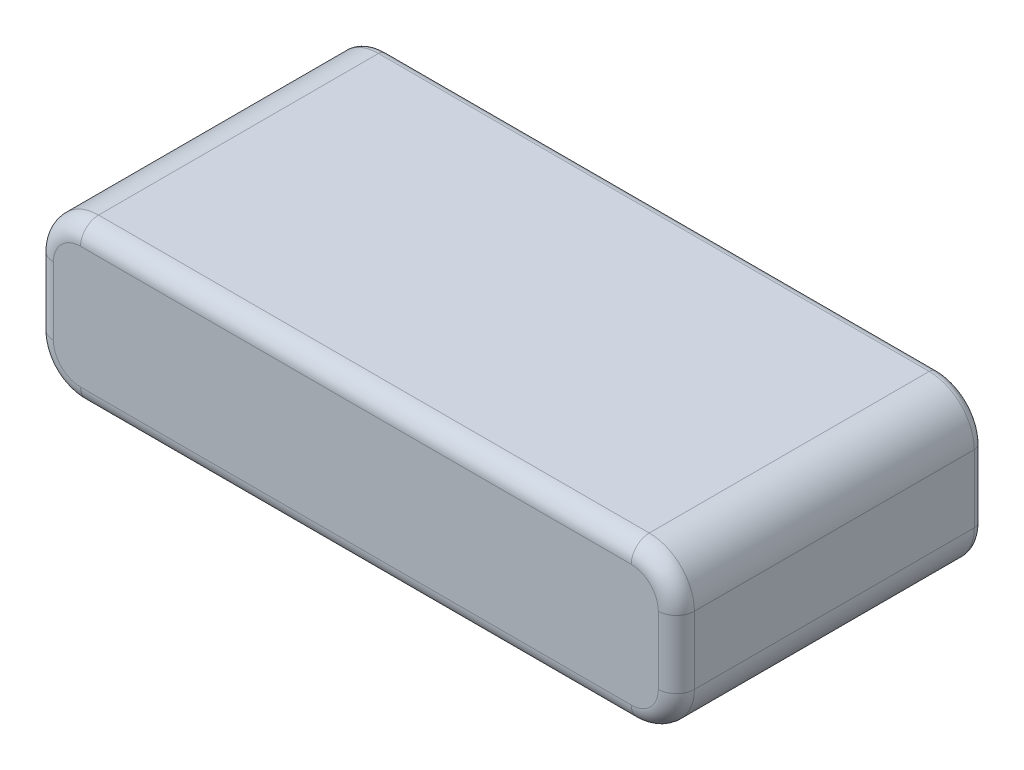
ISO-10303-21;
HEADER;
FILE_DESCRIPTION(('STEP AP214'),'2;1');
FILE_NAME('part.step','',(''),(''),'','','');
FILE_SCHEMA(('AUTOMOTIVE_DESIGN { 1 0 10303 214 1 1 1 1 }'));
ENDSEC;
DATA;
#1=APPLICATION_CONTEXT('core data for automotive mechanical design processes');
#2=APPLICATION_PROTOCOL_DEFINITION('international standard','automotive_design',2000,#1);
#3=PRODUCT_CONTEXT('',#1,'mechanical');
#4=PRODUCT('Part','Part','',(#3));
#5=PRODUCT_RELATED_PRODUCT_CATEGORY('part','',(#4));
#6=PRODUCT_DEFINITION_FORMATION('','',#4);
#7=PRODUCT_DEFINITION_CONTEXT('part definition',#1,'design');
#8=PRODUCT_DEFINITION('design','',#6,#7);
#9=PRODUCT_DEFINITION_SHAPE('','',#8);
#10=(LENGTH_UNIT() NAMED_UNIT(*) SI_UNIT(.MILLI.,.METRE.));
#11=(NAMED_UNIT(*) PLANE_ANGLE_UNIT() SI_UNIT($,.RADIAN.));
#12=(NAMED_UNIT(*) SI_UNIT($,.STERADIAN.) SOLID_ANGLE_UNIT());
#13=UNCERTAINTY_MEASURE_WITH_UNIT(LENGTH_MEASURE(1.E-05),#10,'distance_accuracy_value','');
#14=(GEOMETRIC_REPRESENTATION_CONTEXT(3) GLOBAL_UNCERTAINTY_ASSIGNED_CONTEXT((#13)) GLOBAL_UNIT_ASSIGNED_CONTEXT((#10,
#11,#12)) REPRESENTATION_CONTEXT('',''));
#15=CARTESIAN_POINT('',(0.,0.,0.));
#16=DIRECTION('',(0.,0.,1.));
#17=DIRECTION('',(1.,0.,0.));
#18=AXIS2_PLACEMENT_3D('',#15,#16,#17);
#19=CARTESIAN_POINT('',(-35.5,17.5,17.));
#20=DIRECTION('',(1.,0.,0.));
#21=DIRECTION('',(0.,0.,-1.));
#22=AXIS2_PLACEMENT_3D('',#19,#20,#21);
#23=PLANE('',#22);
#24=DIRECTION('',(0.,0.,1.));
#25=VECTOR('',#24,1.);
#26=CARTESIAN_POINT('',(-35.5,12.5,-17.));
#27=LINE('',#26,#25);
#28=CARTESIAN_POINT('',(-35.5,12.5,15.));
#29=VERTEX_POINT('',#28);
#30=CARTESIAN_POINT('',(-35.5,12.5,-16.));
#31=VERTEX_POINT('',#30);
#32=EDGE_CURVE('E244',#29,#31,#27,.F.);
#33=ORIENTED_EDGE('',*,*,#32,.T.);
#34=DIRECTION('',(0.,-1.,0.));
#35=VECTOR('',#34,1.);
#36=CARTESIAN_POINT('',(-35.5,17.5,-16.));
#37=LINE('',#36,#35);
#38=CARTESIAN_POINT('',(-35.5,5.,-16.));
#39=VERTEX_POINT('',#38);
#40=EDGE_CURVE('E66',#31,#39,#37,.T.);
#41=ORIENTED_EDGE('',*,*,#40,.T.);
#42=DIRECTION('',(0.,0.,1.));
#43=VECTOR('',#42,1.);
#44=CARTESIAN_POINT('',(-35.5,5.,17.));
#45=LINE('',#44,#43);
#46=CARTESIAN_POINT('',(-35.5,5.,15.));
#47=VERTEX_POINT('',#46);
#48=EDGE_CURVE('E333',#39,#47,#45,.T.);
#49=ORIENTED_EDGE('',*,*,#48,.T.);
#50=DIRECTION('',(0.,-1.,0.));
#51=VECTOR('',#50,1.);
#52=CARTESIAN_POINT('',(-35.5,17.5,15.));
#53=LINE('',#52,#51);
#54=EDGE_CURVE('E216',#47,#29,#53,.F.);
#55=ORIENTED_EDGE('',*,*,#54,.T.);
#56=EDGE_LOOP('',(#33,#41,#49,#55));
#57=FACE_BOUND('',#56,.T.);
#58=ADVANCED_FACE('F41',(#57),#23,.F.);
#59=CARTESIAN_POINT('',(35.5,17.5,17.));
#60=DIRECTION('',(0.,0.,-1.));
#61=DIRECTION('',(-1.,0.,0.));
#62=AXIS2_PLACEMENT_3D('',#59,#60,#61);
#63=PLANE('',#62);
#64=DIRECTION('',(1.,0.,0.));
#65=VECTOR('',#64,1.);
#66=CARTESIAN_POINT('',(-30.5,15.5,17.));
#67=LINE('',#66,#65);
#68=CARTESIAN_POINT('',(30.5,15.5,17.));
#69=VERTEX_POINT('',#68);
#70=CARTESIAN_POINT('',(-30.5,15.5,17.));
#71=VERTEX_POINT('',#70);
#72=EDGE_CURVE('E184',#69,#71,#67,.F.);
#73=ORIENTED_EDGE('',*,*,#72,.T.);
#74=CARTESIAN_POINT('',(-30.5,12.5,17.));
#75=DIRECTION('',(0.,0.,-1.));
#76=DIRECTION('',(-1.,0.,0.));
#77=AXIS2_PLACEMENT_3D('',#74,#75,#76);
#78=CIRCLE('',#77,3.);
#79=CARTESIAN_POINT('',(-33.5,12.5,17.));
#80=VERTEX_POINT('',#79);
#81=EDGE_CURVE('E163',#71,#80,#78,.F.);
#82=ORIENTED_EDGE('',*,*,#81,.T.);
#83=DIRECTION('',(0.,-1.,0.));
#84=VECTOR('',#83,1.);
#85=CARTESIAN_POINT('',(-33.5,17.5,17.));
#86=LINE('',#85,#84);
#87=CARTESIAN_POINT('',(-33.5,5.,17.));
#88=VERTEX_POINT('',#87);
#89=EDGE_CURVE('E172',#80,#88,#86,.T.);
#90=ORIENTED_EDGE('',*,*,#89,.T.);
#91=CARTESIAN_POINT('',(-30.5,5.,17.));
#92=DIRECTION('',(0.,0.,-1.));
#93=DIRECTION('',(-1.,0.,0.));
#94=AXIS2_PLACEMENT_3D('',#91,#92,#93);
#95=CIRCLE('',#94,3.);
#96=CARTESIAN_POINT('',(-30.5,2.,17.));
#97=VERTEX_POINT('',#96);
#98=EDGE_CURVE('E179',#88,#97,#95,.F.);
#99=ORIENTED_EDGE('',*,*,#98,.T.);
#100=DIRECTION('',(1.,0.,0.));
#101=VECTOR('',#100,1.);
#102=CARTESIAN_POINT('',(35.5,2.,17.));
#103=LINE('',#102,#101);
#104=CARTESIAN_POINT('',(30.5,2.,17.));
#105=VERTEX_POINT('',#104);
#106=EDGE_CURVE('E358',#97,#105,#103,.T.);
#107=ORIENTED_EDGE('',*,*,#106,.T.);
#108=CARTESIAN_POINT('',(30.5,5.,17.));
#109=DIRECTION('',(0.,0.,-1.));
#110=DIRECTION('',(-1.,0.,0.));
#111=AXIS2_PLACEMENT_3D('',#108,#109,#110);
#112=CIRCLE('',#111,3.);
#113=CARTESIAN_POINT('',(33.5,5.,17.));
#114=VERTEX_POINT('',#113);
#115=EDGE_CURVE('E361',#105,#114,#112,.F.);
#116=ORIENTED_EDGE('',*,*,#115,.T.);
#117=DIRECTION('',(0.,-1.,0.));
#118=VECTOR('',#117,1.);
#119=CARTESIAN_POINT('',(33.5,17.5,17.));
#120=LINE('',#119,#118);
#121=CARTESIAN_POINT('',(33.5,12.5,17.));
#122=VERTEX_POINT('',#121);
#123=EDGE_CURVE('E364',#114,#122,#120,.F.);
#124=ORIENTED_EDGE('',*,*,#123,.T.);
#125=CARTESIAN_POINT('',(30.5,12.5,17.));
#126=DIRECTION('',(0.,0.,-1.));
#127=DIRECTION('',(-1.,0.,0.));
#128=AXIS2_PLACEMENT_3D('',#125,#126,#127);
#129=CIRCLE('',#128,3.);
#130=EDGE_CURVE('E192',#122,#69,#129,.F.);
#131=ORIENTED_EDGE('',*,*,#130,.T.);
#132=EDGE_LOOP('',(#73,#82,#90,#99,#107,#116,#124,#131));
#133=FACE_BOUND('',#132,.T.);
#134=ADVANCED_FACE('F182',(#133),#63,.F.);
#135=CARTESIAN_POINT('',(35.5,17.5,17.));
#136=DIRECTION('',(-1.,0.,0.));
#137=DIRECTION('',(0.,0.,1.));
#138=AXIS2_PLACEMENT_3D('',#135,#136,#137);
#139=PLANE('',#138);
#140=DIRECTION('',(0.,0.,-1.));
#141=VECTOR('',#140,1.);
#142=CARTESIAN_POINT('',(35.5,5.,17.));
#143=LINE('',#142,#141);
#144=CARTESIAN_POINT('',(35.5,5.,15.));
#145=VERTEX_POINT('',#144);
#146=CARTESIAN_POINT('',(35.5,5.,-16.));
#147=VERTEX_POINT('',#146);
#148=EDGE_CURVE('E347',#145,#147,#143,.T.);
#149=ORIENTED_EDGE('',*,*,#148,.T.);
#150=DIRECTION('',(0.,-1.,0.));
#151=VECTOR('',#150,1.);
#152=CARTESIAN_POINT('',(35.5,17.5,-16.));
#153=LINE('',#152,#151);
#154=CARTESIAN_POINT('',(35.5,12.5,-16.));
#155=VERTEX_POINT('',#154);
#156=EDGE_CURVE('E273',#147,#155,#153,.F.);
#157=ORIENTED_EDGE('',*,*,#156,.T.);
#158=DIRECTION('',(0.,0.,-1.));
#159=VECTOR('',#158,1.);
#160=CARTESIAN_POINT('',(35.5,12.5,17.));
#161=LINE('',#160,#159);
#162=CARTESIAN_POINT('',(35.5,12.5,15.));
#163=VERTEX_POINT('',#162);
#164=EDGE_CURVE('E344',#155,#163,#161,.F.);
#165=ORIENTED_EDGE('',*,*,#164,.T.);
#166=DIRECTION('',(0.,-1.,0.));
#167=VECTOR('',#166,1.);
#168=CARTESIAN_POINT('',(35.5,17.5,15.));
#169=LINE('',#168,#167);
#170=EDGE_CURVE('E202',#163,#145,#169,.T.);
#171=ORIENTED_EDGE('',*,*,#170,.T.);
#172=EDGE_LOOP('',(#149,#157,#165,#171));
#173=FACE_BOUND('',#172,.T.);
#174=ADVANCED_FACE('F431',(#173),#139,.F.);
#175=CARTESIAN_POINT('',(35.5,17.5,-17.));
#176=DIRECTION('',(0.,0.,1.));
#177=DIRECTION('',(1.,0.,0.));
#178=AXIS2_PLACEMENT_3D('',#175,#176,#177);
#179=PLANE('',#178);
#180=DIRECTION('',(0.,-1.,0.));
#181=VECTOR('',#180,1.);
#182=CARTESIAN_POINT('',(34.5,17.5,-17.));
#183=LINE('',#182,#181);
#184=CARTESIAN_POINT('',(34.5,12.5,-17.));
#185=VERTEX_POINT('',#184);
#186=CARTESIAN_POINT('',(34.5,5.,-17.));
#187=VERTEX_POINT('',#186);
#188=EDGE_CURVE('E262',#185,#187,#183,.T.);
#189=ORIENTED_EDGE('',*,*,#188,.T.);
#190=CARTESIAN_POINT('',(30.5,5.,-17.));
#191=DIRECTION('',(0.,0.,1.));
#192=DIRECTION('',(1.,0.,0.));
#193=AXIS2_PLACEMENT_3D('',#190,#191,#192);
#194=CIRCLE('',#193,4.);
#195=CARTESIAN_POINT('',(30.5,1.,-17.));
#196=VERTEX_POINT('',#195);
#197=EDGE_CURVE('E265',#187,#196,#194,.F.);
#198=ORIENTED_EDGE('',*,*,#197,.T.);
#199=DIRECTION('',(-1.,0.,0.));
#200=VECTOR('',#199,1.);
#201=CARTESIAN_POINT('',(35.5,1.,-17.));
#202=LINE('',#201,#200);
#203=CARTESIAN_POINT('',(-30.5,1.,-17.));
#204=VERTEX_POINT('',#203);
#205=EDGE_CURVE('E218',#196,#204,#202,.T.);
#206=ORIENTED_EDGE('',*,*,#205,.T.);
#207=CARTESIAN_POINT('',(-30.5,5.,-17.));
#208=DIRECTION('',(0.,0.,1.));
#209=DIRECTION('',(1.,0.,0.));
#210=AXIS2_PLACEMENT_3D('',#207,#208,#209);
#211=CIRCLE('',#210,4.);
#212=CARTESIAN_POINT('',(-34.5,5.,-17.));
#213=VERTEX_POINT('',#212);
#214=EDGE_CURVE('E247',#204,#213,#211,.F.);
#215=ORIENTED_EDGE('',*,*,#214,.T.);
#216=DIRECTION('',(0.,-1.,0.));
#217=VECTOR('',#216,1.);
#218=CARTESIAN_POINT('',(-34.5,17.5,-17.));
#219=LINE('',#218,#217);
#220=CARTESIAN_POINT('',(-34.5,12.5,-17.));
#221=VERTEX_POINT('',#220);
#222=EDGE_CURVE('E250',#213,#221,#219,.F.);
#223=ORIENTED_EDGE('',*,*,#222,.T.);
#224=CARTESIAN_POINT('',(-30.5,12.5,-17.));
#225=DIRECTION('',(0.,0.,1.));
#226=DIRECTION('',(1.,0.,0.));
#227=AXIS2_PLACEMENT_3D('',#224,#225,#226);
#228=CIRCLE('',#227,4.);
#229=CARTESIAN_POINT('',(-30.5,16.5,-17.));
#230=VERTEX_POINT('',#229);
#231=EDGE_CURVE('E253',#221,#230,#228,.F.);
#232=ORIENTED_EDGE('',*,*,#231,.T.);
#233=DIRECTION('',(-1.,0.,0.));
#234=VECTOR('',#233,1.);
#235=CARTESIAN_POINT('',(30.5,16.5,-17.));
#236=LINE('',#235,#234);
#237=CARTESIAN_POINT('',(30.5,16.5,-17.));
#238=VERTEX_POINT('',#237);
#239=EDGE_CURVE('E256',#230,#238,#236,.F.);
#240=ORIENTED_EDGE('',*,*,#239,.T.);
#241=CARTESIAN_POINT('',(30.5,12.5,-17.));
#242=DIRECTION('',(0.,0.,1.));
#243=DIRECTION('',(1.,0.,0.));
#244=AXIS2_PLACEMENT_3D('',#241,#242,#243);
#245=CIRCLE('',#244,4.);
#246=EDGE_CURVE('E259',#238,#185,#245,.F.);
#247=ORIENTED_EDGE('',*,*,#246,.T.);
#248=EDGE_LOOP('',(#189,#198,#206,#215,#223,#232,#240,#247));
#249=FACE_BOUND('',#248,.T.);
#250=ADVANCED_FACE('F396',(#249),#179,.F.);
#251=CARTESIAN_POINT('',(0.,17.5,0.));
#252=DIRECTION('',(0.,1.,0.));
#253=DIRECTION('',(0.,0.,1.));
#254=AXIS2_PLACEMENT_3D('',#251,#252,#253);
#255=PLANE('',#254);
#256=DIRECTION('',(0.,0.,-1.));
#257=VECTOR('',#256,1.);
#258=CARTESIAN_POINT('',(30.5,17.5,-17.));
#259=LINE('',#258,#257);
#260=CARTESIAN_POINT('',(30.5,17.5,15.));
#261=VERTEX_POINT('',#260);
#262=CARTESIAN_POINT('',(30.5,17.5,-16.));
#263=VERTEX_POINT('',#262);
#264=EDGE_CURVE('E180',#261,#263,#259,.T.);
#265=ORIENTED_EDGE('',*,*,#264,.T.);
#266=DIRECTION('',(-1.,0.,0.));
#267=VECTOR('',#266,1.);
#268=CARTESIAN_POINT('',(-30.5,17.5,-16.));
#269=LINE('',#268,#267);
#270=CARTESIAN_POINT('',(-30.5,17.5,-16.));
#271=VERTEX_POINT('',#270);
#272=EDGE_CURVE('E279',#263,#271,#269,.T.);
#273=ORIENTED_EDGE('',*,*,#272,.T.);
#274=DIRECTION('',(0.,0.,1.));
#275=VECTOR('',#274,1.);
#276=CARTESIAN_POINT('',(-30.5,17.5,17.));
#277=LINE('',#276,#275);
#278=CARTESIAN_POINT('',(-30.5,17.5,15.));
#279=VERTEX_POINT('',#278);
#280=EDGE_CURVE('E331',#271,#279,#277,.T.);
#281=ORIENTED_EDGE('',*,*,#280,.T.);
#282=DIRECTION('',(1.,0.,0.));
#283=VECTOR('',#282,1.);
#284=CARTESIAN_POINT('',(30.5,17.5,15.));
#285=LINE('',#284,#283);
#286=EDGE_CURVE('E190',#279,#261,#285,.T.);
#287=ORIENTED_EDGE('',*,*,#286,.T.);
#288=EDGE_LOOP('',(#265,#273,#281,#287));
#289=FACE_BOUND('',#288,.T.);
#290=ADVANCED_FACE('F379',(#289),#255,.T.);
#291=CARTESIAN_POINT('',(0.,0.,0.));
#292=DIRECTION('',(0.,1.,0.));
#293=DIRECTION('',(0.,0.,1.));
#294=AXIS2_PLACEMENT_3D('',#291,#292,#293);
#295=PLANE('',#294);
#296=DIRECTION('',(0.,0.,1.));
#297=VECTOR('',#296,1.);
#298=CARTESIAN_POINT('',(-30.5,0.,0.));
#299=LINE('',#298,#297);
#300=CARTESIAN_POINT('',(-30.5,0.,15.));
#301=VERTEX_POINT('',#300);
#302=CARTESIAN_POINT('',(-30.5,0.,-16.));
#303=VERTEX_POINT('',#302);
#304=EDGE_CURVE('E341',#301,#303,#299,.F.);
#305=ORIENTED_EDGE('',*,*,#304,.T.);
#306=DIRECTION('',(-1.,0.,0.));
#307=VECTOR('',#306,1.);
#308=CARTESIAN_POINT('',(0.,0.,-16.));
#309=LINE('',#308,#307);
#310=CARTESIAN_POINT('',(30.5,0.,-16.));
#311=VERTEX_POINT('',#310);
#312=EDGE_CURVE('E11',#303,#311,#309,.F.);
#313=ORIENTED_EDGE('',*,*,#312,.T.);
#314=DIRECTION('',(0.,0.,-1.));
#315=VECTOR('',#314,1.);
#316=CARTESIAN_POINT('',(30.5,0.,0.));
#317=LINE('',#316,#315);
#318=CARTESIAN_POINT('',(30.5,0.,15.));
#319=VERTEX_POINT('',#318);
#320=EDGE_CURVE('E336',#311,#319,#317,.F.);
#321=ORIENTED_EDGE('',*,*,#320,.T.);
#322=DIRECTION('',(1.,0.,0.));
#323=VECTOR('',#322,1.);
#324=CARTESIAN_POINT('',(0.,0.,15.));
#325=LINE('',#324,#323);
#326=EDGE_CURVE('E209',#319,#301,#325,.F.);
#327=ORIENTED_EDGE('',*,*,#326,.T.);
#328=EDGE_LOOP('',(#305,#313,#321,#327));
#329=FACE_BOUND('',#328,.T.);
#330=ADVANCED_FACE('F410',(#329),#295,.F.);
#331=CARTESIAN_POINT('',(-30.5,5.,17.));
#332=DIRECTION('',(0.,0.,1.));
#333=DIRECTION('',(1.,0.,0.));
#334=AXIS2_PLACEMENT_3D('',#331,#332,#333);
#335=CYLINDRICAL_SURFACE('',#334,5.);
#336=ORIENTED_EDGE('',*,*,#48,.F.);
#337=CARTESIAN_POINT('',(-30.5,5.,-16.));
#338=DIRECTION('',(0.,0.,1.));
#339=DIRECTION('',(1.,0.,0.));
#340=AXIS2_PLACEMENT_3D('',#337,#338,#339);
#341=CIRCLE('',#340,5.);
#342=EDGE_CURVE('E51',#39,#303,#341,.T.);
#343=ORIENTED_EDGE('',*,*,#342,.T.);
#344=ORIENTED_EDGE('',*,*,#304,.F.);
#345=CARTESIAN_POINT('',(-30.5,5.,15.));
#346=DIRECTION('',(0.,0.,-1.));
#347=DIRECTION('',(-1.,0.,0.));
#348=AXIS2_PLACEMENT_3D('',#345,#346,#347);
#349=CIRCLE('',#348,5.);
#350=EDGE_CURVE('E212',#301,#47,#349,.T.);
#351=ORIENTED_EDGE('',*,*,#350,.T.);
#352=EDGE_LOOP('',(#336,#343,#344,#351));
#353=FACE_BOUND('',#352,.T.);
#354=ADVANCED_FACE('F435',(#353),#335,.T.);
#355=CARTESIAN_POINT('',(30.5,5.,17.));
#356=DIRECTION('',(0.,0.,-1.));
#357=DIRECTION('',(-1.,0.,0.));
#358=AXIS2_PLACEMENT_3D('',#355,#356,#357);
#359=CYLINDRICAL_SURFACE('',#358,5.);
#360=ORIENTED_EDGE('',*,*,#320,.F.);
#361=CARTESIAN_POINT('',(30.5,5.,-16.));
#362=DIRECTION('',(0.,0.,1.));
#363=DIRECTION('',(1.,0.,0.));
#364=AXIS2_PLACEMENT_3D('',#361,#362,#363);
#365=CIRCLE('',#364,5.);
#366=EDGE_CURVE('E269',#311,#147,#365,.T.);
#367=ORIENTED_EDGE('',*,*,#366,.T.);
#368=ORIENTED_EDGE('',*,*,#148,.F.);
#369=CARTESIAN_POINT('',(30.5,5.,15.));
#370=DIRECTION('',(0.,0.,-1.));
#371=DIRECTION('',(-1.,0.,0.));
#372=AXIS2_PLACEMENT_3D('',#369,#370,#371);
#373=CIRCLE('',#372,5.);
#374=EDGE_CURVE('E205',#145,#319,#373,.T.);
#375=ORIENTED_EDGE('',*,*,#374,.T.);
#376=EDGE_LOOP('',(#360,#367,#368,#375));
#377=FACE_BOUND('',#376,.T.);
#378=ADVANCED_FACE('F413',(#377),#359,.T.);
#379=CARTESIAN_POINT('',(30.5,12.5,0.));
#380=DIRECTION('',(0.,0.,1.));
#381=DIRECTION('',(1.,0.,0.));
#382=AXIS2_PLACEMENT_3D('',#379,#380,#381);
#383=CYLINDRICAL_SURFACE('',#382,5.);
#384=ORIENTED_EDGE('',*,*,#164,.F.);
#385=CARTESIAN_POINT('',(30.5,12.5,-16.));
#386=DIRECTION('',(0.,0.,1.));
#387=DIRECTION('',(1.,0.,0.));
#388=AXIS2_PLACEMENT_3D('',#385,#386,#387);
#389=CIRCLE('',#388,5.);
#390=EDGE_CURVE('E276',#155,#263,#389,.T.);
#391=ORIENTED_EDGE('',*,*,#390,.T.);
#392=ORIENTED_EDGE('',*,*,#264,.F.);
#393=CARTESIAN_POINT('',(30.5,12.5,15.));
#394=DIRECTION('',(0.,0.,-1.));
#395=DIRECTION('',(-1.,0.,0.));
#396=AXIS2_PLACEMENT_3D('',#393,#394,#395);
#397=CIRCLE('',#396,5.);
#398=EDGE_CURVE('E198',#261,#163,#397,.T.);
#399=ORIENTED_EDGE('',*,*,#398,.T.);
#400=EDGE_LOOP('',(#384,#391,#392,#399));
#401=FACE_BOUND('',#400,.T.);
#402=ADVANCED_FACE('F382',(#401),#383,.T.);
#403=CARTESIAN_POINT('',(-30.5,12.5,0.));
#404=DIRECTION('',(0.,0.,-1.));
#405=DIRECTION('',(-1.,0.,0.));
#406=AXIS2_PLACEMENT_3D('',#403,#404,#405);
#407=CYLINDRICAL_SURFACE('',#406,5.);
#408=ORIENTED_EDGE('',*,*,#280,.F.);
#409=CARTESIAN_POINT('',(-30.5,12.5,-16.));
#410=DIRECTION('',(0.,0.,1.));
#411=DIRECTION('',(1.,0.,0.));
#412=AXIS2_PLACEMENT_3D('',#409,#410,#411);
#413=CIRCLE('',#412,5.);
#414=EDGE_CURVE('E282',#271,#31,#413,.T.);
#415=ORIENTED_EDGE('',*,*,#414,.T.);
#416=ORIENTED_EDGE('',*,*,#32,.F.);
#417=CARTESIAN_POINT('',(-30.5,12.5,15.));
#418=DIRECTION('',(0.,0.,-1.));
#419=DIRECTION('',(-1.,0.,0.));
#420=AXIS2_PLACEMENT_3D('',#417,#418,#419);
#421=CIRCLE('',#420,5.);
#422=EDGE_CURVE('E165',#29,#279,#421,.T.);
#423=ORIENTED_EDGE('',*,*,#422,.T.);
#424=EDGE_LOOP('',(#408,#415,#416,#423));
#425=FACE_BOUND('',#424,.T.);
#426=ADVANCED_FACE('F330',(#425),#407,.T.);
#427=CARTESIAN_POINT('',(30.5,5.,15.));
#428=DIRECTION('',(0.,0.,-1.));
#429=DIRECTION('',(-1.,0.,0.));
#430=AXIS2_PLACEMENT_3D('',#427,#428,#429);
#431=TOROIDAL_SURFACE('',#430,3.,2.);
#432=CARTESIAN_POINT('',(30.5,2.,15.));
#433=DIRECTION('',(-1.,0.,0.));
#434=DIRECTION('',(0.,0.,1.));
#435=AXIS2_PLACEMENT_3D('',#432,#433,#434);
#436=CIRCLE('',#435,2.);
#437=EDGE_CURVE('E236',#319,#105,#436,.T.);
#438=ORIENTED_EDGE('',*,*,#437,.F.);
#439=ORIENTED_EDGE('',*,*,#374,.F.);
#440=CARTESIAN_POINT('',(33.5,5.,15.));
#441=DIRECTION('',(0.,1.,0.));
#442=DIRECTION('',(0.,0.,1.));
#443=AXIS2_PLACEMENT_3D('',#440,#441,#442);
#444=CIRCLE('',#443,2.);
#445=EDGE_CURVE('E240',#114,#145,#444,.T.);
#446=ORIENTED_EDGE('',*,*,#445,.F.);
#447=ORIENTED_EDGE('',*,*,#115,.F.);
#448=EDGE_LOOP('',(#438,#439,#446,#447));
#449=FACE_BOUND('',#448,.T.);
#450=ADVANCED_FACE('F444',(#449),#431,.T.);
#451=CARTESIAN_POINT('',(33.5,17.5,15.));
#452=DIRECTION('',(0.,-1.,0.));
#453=DIRECTION('',(0.,0.,-1.));
#454=AXIS2_PLACEMENT_3D('',#451,#452,#453);
#455=CYLINDRICAL_SURFACE('',#454,2.);
#456=ORIENTED_EDGE('',*,*,#445,.T.);
#457=ORIENTED_EDGE('',*,*,#170,.F.);
#458=CARTESIAN_POINT('',(33.5,12.5,15.));
#459=DIRECTION('',(0.,1.,0.));
#460=DIRECTION('',(0.,0.,1.));
#461=AXIS2_PLACEMENT_3D('',#458,#459,#460);
#462=CIRCLE('',#461,2.);
#463=EDGE_CURVE('E232',#122,#163,#462,.T.);
#464=ORIENTED_EDGE('',*,*,#463,.F.);
#465=ORIENTED_EDGE('',*,*,#123,.F.);
#466=EDGE_LOOP('',(#456,#457,#464,#465));
#467=FACE_BOUND('',#466,.T.);
#468=ADVANCED_FACE('F460',(#467),#455,.T.);
#469=CARTESIAN_POINT('',(35.5,2.,15.));
#470=DIRECTION('',(1.,0.,0.));
#471=DIRECTION('',(0.,0.,-1.));
#472=AXIS2_PLACEMENT_3D('',#469,#470,#471);
#473=CYLINDRICAL_SURFACE('',#472,2.);
#474=ORIENTED_EDGE('',*,*,#437,.T.);
#475=ORIENTED_EDGE('',*,*,#106,.F.);
#476=CARTESIAN_POINT('',(-30.5,2.,15.));
#477=DIRECTION('',(-1.,0.,0.));
#478=DIRECTION('',(0.,0.,1.));
#479=AXIS2_PLACEMENT_3D('',#476,#477,#478);
#480=CIRCLE('',#479,2.);
#481=EDGE_CURVE('E228',#301,#97,#480,.T.);
#482=ORIENTED_EDGE('',*,*,#481,.F.);
#483=ORIENTED_EDGE('',*,*,#326,.F.);
#484=EDGE_LOOP('',(#474,#475,#482,#483));
#485=FACE_BOUND('',#484,.T.);
#486=ADVANCED_FACE('F457',(#485),#473,.T.);
#487=CARTESIAN_POINT('',(30.5,12.5,15.));
#488=DIRECTION('',(0.,0.,-1.));
#489=DIRECTION('',(-1.,0.,0.));
#490=AXIS2_PLACEMENT_3D('',#487,#488,#489);
#491=TOROIDAL_SURFACE('',#490,3.,2.);
#492=ORIENTED_EDGE('',*,*,#463,.T.);
#493=ORIENTED_EDGE('',*,*,#398,.F.);
#494=CARTESIAN_POINT('',(30.5,15.5,15.));
#495=DIRECTION('',(-1.,0.,0.));
#496=DIRECTION('',(0.,0.,1.));
#497=AXIS2_PLACEMENT_3D('',#494,#495,#496);
#498=CIRCLE('',#497,2.);
#499=EDGE_CURVE('E224',#69,#261,#498,.T.);
#500=ORIENTED_EDGE('',*,*,#499,.F.);
#501=ORIENTED_EDGE('',*,*,#130,.F.);
#502=EDGE_LOOP('',(#492,#493,#500,#501));
#503=FACE_BOUND('',#502,.T.);
#504=ADVANCED_FACE('F373',(#503),#491,.T.);
#505=CARTESIAN_POINT('',(-30.5,5.,15.));
#506=DIRECTION('',(0.,0.,-1.));
#507=DIRECTION('',(-1.,0.,0.));
#508=AXIS2_PLACEMENT_3D('',#505,#506,#507);
#509=TOROIDAL_SURFACE('',#508,3.,2.);
#510=ORIENTED_EDGE('',*,*,#481,.T.);
#511=ORIENTED_EDGE('',*,*,#98,.F.);
#512=CARTESIAN_POINT('',(-33.5,5.,15.));
#513=DIRECTION('',(0.,1.,0.));
#514=DIRECTION('',(0.,0.,1.));
#515=AXIS2_PLACEMENT_3D('',#512,#513,#514);
#516=CIRCLE('',#515,2.);
#517=EDGE_CURVE('E175',#47,#88,#516,.T.);
#518=ORIENTED_EDGE('',*,*,#517,.F.);
#519=ORIENTED_EDGE('',*,*,#350,.F.);
#520=EDGE_LOOP('',(#510,#511,#518,#519));
#521=FACE_BOUND('',#520,.T.);
#522=ADVANCED_FACE('F451',(#521),#509,.T.);
#523=CARTESIAN_POINT('',(0.,15.5,15.));
#524=DIRECTION('',(-1.,0.,0.));
#525=DIRECTION('',(0.,0.,1.));
#526=AXIS2_PLACEMENT_3D('',#523,#524,#525);
#527=CYLINDRICAL_SURFACE('',#526,2.);
#528=ORIENTED_EDGE('',*,*,#499,.T.);
#529=ORIENTED_EDGE('',*,*,#286,.F.);
#530=CARTESIAN_POINT('',(-30.5,15.5,15.));
#531=DIRECTION('',(-1.,0.,0.));
#532=DIRECTION('',(0.,0.,1.));
#533=AXIS2_PLACEMENT_3D('',#530,#531,#532);
#534=CIRCLE('',#533,2.);
#535=EDGE_CURVE('E169',#71,#279,#534,.T.);
#536=ORIENTED_EDGE('',*,*,#535,.F.);
#537=ORIENTED_EDGE('',*,*,#72,.F.);
#538=EDGE_LOOP('',(#528,#529,#536,#537));
#539=FACE_BOUND('',#538,.T.);
#540=ADVANCED_FACE('F376',(#539),#527,.T.);
#541=CARTESIAN_POINT('',(-33.5,17.5,15.));
#542=DIRECTION('',(0.,-1.,0.));
#543=DIRECTION('',(0.,0.,-1.));
#544=AXIS2_PLACEMENT_3D('',#541,#542,#543);
#545=CYLINDRICAL_SURFACE('',#544,2.);
#546=ORIENTED_EDGE('',*,*,#517,.T.);
#547=ORIENTED_EDGE('',*,*,#89,.F.);
#548=CARTESIAN_POINT('',(-33.5,12.5,15.));
#549=DIRECTION('',(0.,1.,0.));
#550=DIRECTION('',(0.,0.,1.));
#551=AXIS2_PLACEMENT_3D('',#548,#549,#550);
#552=CIRCLE('',#551,2.);
#553=EDGE_CURVE('E158',#29,#80,#552,.T.);
#554=ORIENTED_EDGE('',*,*,#553,.F.);
#555=ORIENTED_EDGE('',*,*,#54,.F.);
#556=EDGE_LOOP('',(#546,#547,#554,#555));
#557=FACE_BOUND('',#556,.T.);
#558=ADVANCED_FACE('F173',(#557),#545,.T.);
#559=CARTESIAN_POINT('',(-30.5,12.5,15.));
#560=DIRECTION('',(0.,0.,-1.));
#561=DIRECTION('',(-1.,0.,0.));
#562=AXIS2_PLACEMENT_3D('',#559,#560,#561);
#563=TOROIDAL_SURFACE('',#562,3.,2.);
#564=ORIENTED_EDGE('',*,*,#535,.T.);
#565=ORIENTED_EDGE('',*,*,#422,.F.);
#566=ORIENTED_EDGE('',*,*,#553,.T.);
#567=ORIENTED_EDGE('',*,*,#81,.F.);
#568=EDGE_LOOP('',(#564,#565,#566,#567));
#569=FACE_BOUND('',#568,.T.);
#570=ADVANCED_FACE('F161',(#569),#563,.T.);
#571=CARTESIAN_POINT('',(-30.5,12.5,-16.));
#572=DIRECTION('',(0.,0.,1.));
#573=DIRECTION('',(1.,0.,0.));
#574=AXIS2_PLACEMENT_3D('',#571,#572,#573);
#575=TOROIDAL_SURFACE('',#574,4.,1.);
#576=CARTESIAN_POINT('',(-34.5,12.5,-16.));
#577=DIRECTION('',(0.,-1.,0.));
#578=DIRECTION('',(0.,0.,-1.));
#579=AXIS2_PLACEMENT_3D('',#576,#577,#578);
#580=CIRCLE('',#579,1.);
#581=EDGE_CURVE('E310',#31,#221,#580,.T.);
#582=ORIENTED_EDGE('',*,*,#581,.F.);
#583=ORIENTED_EDGE('',*,*,#414,.F.);
#584=CARTESIAN_POINT('',(-30.5,16.5,-16.));
#585=DIRECTION('',(1.,0.,0.));
#586=DIRECTION('',(0.,0.,-1.));
#587=AXIS2_PLACEMENT_3D('',#584,#585,#586);
#588=CIRCLE('',#587,1.);
#589=EDGE_CURVE('E45',#230,#271,#588,.T.);
#590=ORIENTED_EDGE('',*,*,#589,.F.);
#591=ORIENTED_EDGE('',*,*,#231,.F.);
#592=EDGE_LOOP('',(#582,#583,#590,#591));
#593=FACE_BOUND('',#592,.T.);
#594=ADVANCED_FACE('F43',(#593),#575,.T.);
#595=CARTESIAN_POINT('',(0.,16.5,-16.));
#596=DIRECTION('',(1.,0.,0.));
#597=DIRECTION('',(0.,0.,-1.));
#598=AXIS2_PLACEMENT_3D('',#595,#596,#597);
#599=CYLINDRICAL_SURFACE('',#598,1.);
#600=ORIENTED_EDGE('',*,*,#589,.T.);
#601=ORIENTED_EDGE('',*,*,#272,.F.);
#602=CARTESIAN_POINT('',(30.5,16.5,-16.));
#603=DIRECTION('',(1.,0.,0.));
#604=DIRECTION('',(0.,0.,-1.));
#605=AXIS2_PLACEMENT_3D('',#602,#603,#604);
#606=CIRCLE('',#605,1.);
#607=EDGE_CURVE('E307',#238,#263,#606,.T.);
#608=ORIENTED_EDGE('',*,*,#607,.F.);
#609=ORIENTED_EDGE('',*,*,#239,.F.);
#610=EDGE_LOOP('',(#600,#601,#608,#609));
#611=FACE_BOUND('',#610,.T.);
#612=ADVANCED_FACE('F322',(#611),#599,.T.);
#613=CARTESIAN_POINT('',(-34.5,17.5,-16.));
#614=DIRECTION('',(0.,-1.,0.));
#615=DIRECTION('',(0.,0.,-1.));
#616=AXIS2_PLACEMENT_3D('',#613,#614,#615);
#617=CYLINDRICAL_SURFACE('',#616,1.);
#618=ORIENTED_EDGE('',*,*,#581,.T.);
#619=ORIENTED_EDGE('',*,*,#222,.F.);
#620=CARTESIAN_POINT('',(-34.5,5.,-16.));
#621=DIRECTION('',(0.,-1.,0.));
#622=DIRECTION('',(0.,0.,-1.));
#623=AXIS2_PLACEMENT_3D('',#620,#621,#622);
#624=CIRCLE('',#623,1.);
#625=EDGE_CURVE('E303',#39,#213,#624,.T.);
#626=ORIENTED_EDGE('',*,*,#625,.F.);
#627=ORIENTED_EDGE('',*,*,#40,.F.);
#628=EDGE_LOOP('',(#618,#619,#626,#627));
#629=FACE_BOUND('',#628,.T.);
#630=ADVANCED_FACE('F399',(#629),#617,.T.);
#631=CARTESIAN_POINT('',(30.5,12.5,-16.));
#632=DIRECTION('',(0.,0.,1.));
#633=DIRECTION('',(1.,0.,0.));
#634=AXIS2_PLACEMENT_3D('',#631,#632,#633);
#635=TOROIDAL_SURFACE('',#634,4.,1.);
#636=ORIENTED_EDGE('',*,*,#607,.T.);
#637=ORIENTED_EDGE('',*,*,#390,.F.);
#638=CARTESIAN_POINT('',(34.5,12.5,-16.));
#639=DIRECTION('',(0.,-1.,0.));
#640=DIRECTION('',(0.,0.,-1.));
#641=AXIS2_PLACEMENT_3D('',#638,#639,#640);
#642=CIRCLE('',#641,1.);
#643=EDGE_CURVE('E299',#185,#155,#642,.T.);
#644=ORIENTED_EDGE('',*,*,#643,.F.);
#645=ORIENTED_EDGE('',*,*,#246,.F.);
#646=EDGE_LOOP('',(#636,#637,#644,#645));
#647=FACE_BOUND('',#646,.T.);
#648=ADVANCED_FACE('F387',(#647),#635,.T.);
#649=CARTESIAN_POINT('',(-30.5,5.,-16.));
#650=DIRECTION('',(0.,0.,1.));
#651=DIRECTION('',(1.,0.,0.));
#652=AXIS2_PLACEMENT_3D('',#649,#650,#651);
#653=TOROIDAL_SURFACE('',#652,4.,1.);
#654=ORIENTED_EDGE('',*,*,#625,.T.);
#655=ORIENTED_EDGE('',*,*,#214,.F.);
#656=CARTESIAN_POINT('',(-30.5,1.,-16.));
#657=DIRECTION('',(1.,0.,0.));
#658=DIRECTION('',(0.,0.,-1.));
#659=AXIS2_PLACEMENT_3D('',#656,#657,#658);
#660=CIRCLE('',#659,1.);
#661=EDGE_CURVE('E295',#303,#204,#660,.T.);
#662=ORIENTED_EDGE('',*,*,#661,.F.);
#663=ORIENTED_EDGE('',*,*,#342,.F.);
#664=EDGE_LOOP('',(#654,#655,#662,#663));
#665=FACE_BOUND('',#664,.T.);
#666=ADVANCED_FACE('F401',(#665),#653,.T.);
#667=CARTESIAN_POINT('',(34.5,17.5,-16.));
#668=DIRECTION('',(0.,-1.,0.));
#669=DIRECTION('',(0.,0.,-1.));
#670=AXIS2_PLACEMENT_3D('',#667,#668,#669);
#671=CYLINDRICAL_SURFACE('',#670,1.);
#672=ORIENTED_EDGE('',*,*,#643,.T.);
#673=ORIENTED_EDGE('',*,*,#156,.F.);
#674=CARTESIAN_POINT('',(34.5,5.,-16.));
#675=DIRECTION('',(0.,-1.,0.));
#676=DIRECTION('',(0.,0.,-1.));
#677=AXIS2_PLACEMENT_3D('',#674,#675,#676);
#678=CIRCLE('',#677,1.);
#679=EDGE_CURVE('E292',#187,#147,#678,.T.);
#680=ORIENTED_EDGE('',*,*,#679,.F.);
#681=ORIENTED_EDGE('',*,*,#188,.F.);
#682=EDGE_LOOP('',(#672,#673,#680,#681));
#683=FACE_BOUND('',#682,.T.);
#684=ADVANCED_FACE('F392',(#683),#671,.T.);
#685=CARTESIAN_POINT('',(35.5,1.,-16.));
#686=DIRECTION('',(-1.,0.,0.));
#687=DIRECTION('',(0.,0.,1.));
#688=AXIS2_PLACEMENT_3D('',#685,#686,#687);
#689=CYLINDRICAL_SURFACE('',#688,1.);
#690=ORIENTED_EDGE('',*,*,#661,.T.);
#691=ORIENTED_EDGE('',*,*,#205,.F.);
#692=CARTESIAN_POINT('',(30.5,1.,-16.));
#693=DIRECTION('',(1.,0.,0.));
#694=DIRECTION('',(0.,0.,-1.));
#695=AXIS2_PLACEMENT_3D('',#692,#693,#694);
#696=CIRCLE('',#695,1.);
#697=EDGE_CURVE('E289',#311,#196,#696,.T.);
#698=ORIENTED_EDGE('',*,*,#697,.F.);
#699=ORIENTED_EDGE('',*,*,#312,.F.);
#700=EDGE_LOOP('',(#690,#691,#698,#699));
#701=FACE_BOUND('',#700,.T.);
#702=ADVANCED_FACE('F407',(#701),#689,.T.);
#703=CARTESIAN_POINT('',(30.5,5.,-16.));
#704=DIRECTION('',(0.,0.,1.));
#705=DIRECTION('',(1.,0.,0.));
#706=AXIS2_PLACEMENT_3D('',#703,#704,#705);
#707=TOROIDAL_SURFACE('',#706,4.,1.);
#708=ORIENTED_EDGE('',*,*,#679,.T.);
#709=ORIENTED_EDGE('',*,*,#366,.F.);
#710=ORIENTED_EDGE('',*,*,#697,.T.);
#711=ORIENTED_EDGE('',*,*,#197,.F.);
#712=EDGE_LOOP('',(#708,#709,#710,#711));
#713=FACE_BOUND('',#712,.T.);
#714=ADVANCED_FACE('F418',(#713),#707,.T.);
#715=CLOSED_SHELL('',(#58,#134,#174,#250,#290,#330,#354,#378,#402,#426,#450,#468,#486,#504,#522,
#540,#558,#570,#594,#612,#630,#648,#666,#684,#702,#714));
#716=MANIFOLD_SOLID_BREP('B2',#715);
#717=ADVANCED_BREP_SHAPE_REPRESENTATION('',(#18,#716),#14);
#718=SHAPE_DEFINITION_REPRESENTATION(#9,#717);
ENDSEC;
END-ISO-10303-21;
